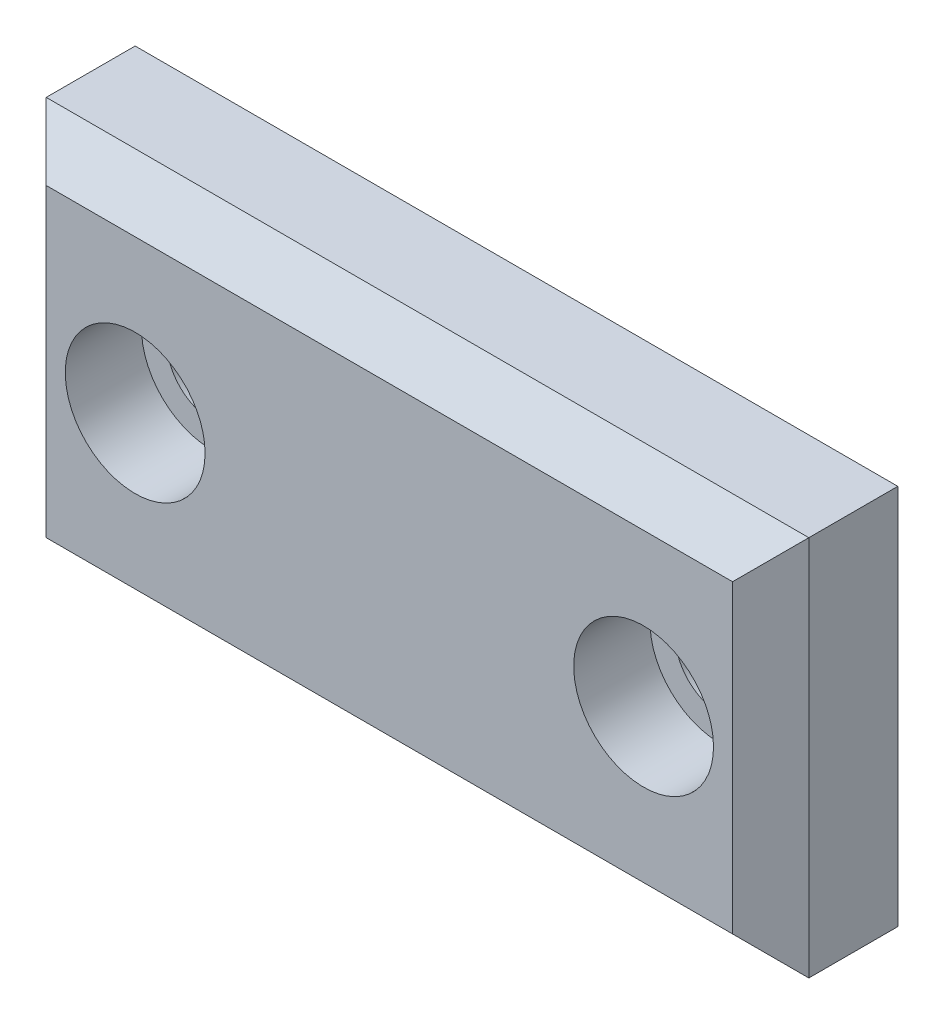
ISO-10303-21;
HEADER;
FILE_DESCRIPTION(('STEP AP214'),'2;1');
FILE_NAME('part.step','',(''),(''),'','','');
FILE_SCHEMA(('AUTOMOTIVE_DESIGN { 1 0 10303 214 1 1 1 1 }'));
ENDSEC;
DATA;
#1=APPLICATION_CONTEXT('core data for automotive mechanical design processes');
#2=APPLICATION_PROTOCOL_DEFINITION('international standard','automotive_design',2000,#1);
#3=PRODUCT_CONTEXT('',#1,'mechanical');
#4=PRODUCT('Part','Part','',(#3));
#5=PRODUCT_RELATED_PRODUCT_CATEGORY('part','',(#4));
#6=PRODUCT_DEFINITION_FORMATION('','',#4);
#7=PRODUCT_DEFINITION_CONTEXT('part definition',#1,'design');
#8=PRODUCT_DEFINITION('design','',#6,#7);
#9=PRODUCT_DEFINITION_SHAPE('','',#8);
#10=(LENGTH_UNIT() NAMED_UNIT(*) SI_UNIT(.MILLI.,.METRE.));
#11=(NAMED_UNIT(*) PLANE_ANGLE_UNIT() SI_UNIT($,.RADIAN.));
#12=(NAMED_UNIT(*) SI_UNIT($,.STERADIAN.) SOLID_ANGLE_UNIT());
#13=UNCERTAINTY_MEASURE_WITH_UNIT(LENGTH_MEASURE(1.E-05),#10,'distance_accuracy_value','');
#14=(GEOMETRIC_REPRESENTATION_CONTEXT(3) GLOBAL_UNCERTAINTY_ASSIGNED_CONTEXT((#13)) GLOBAL_UNIT_ASSIGNED_CONTEXT((#10,
#11,#12)) REPRESENTATION_CONTEXT('',''));
#15=CARTESIAN_POINT('',(0.,0.,0.));
#16=DIRECTION('',(0.,0.,1.));
#17=DIRECTION('',(1.,0.,0.));
#18=AXIS2_PLACEMENT_3D('',#15,#16,#17);
#19=CARTESIAN_POINT('',(20.,0.,0.));
#20=DIRECTION('',(0.,0.,1.));
#21=DIRECTION('',(1.,0.,0.));
#22=AXIS2_PLACEMENT_3D('',#19,#20,#21);
#23=CYLINDRICAL_SURFACE('',#22,3.5);
#24=CARTESIAN_POINT('',(20.,0.,0.));
#25=DIRECTION('',(0.,0.,1.));
#26=DIRECTION('',(1.,0.,0.));
#27=AXIS2_PLACEMENT_3D('',#24,#25,#26);
#28=CIRCLE('',#27,3.5);
#29=CARTESIAN_POINT('',(23.5,0.,0.));
#30=VERTEX_POINT('',#29);
#31=EDGE_CURVE('E147',#30,#30,#28,.T.);
#32=ORIENTED_EDGE('',*,*,#31,.F.);
#33=EDGE_LOOP('',(#32));
#34=FACE_BOUND('',#33,.T.);
#35=CARTESIAN_POINT('',(20.,0.,4.));
#36=DIRECTION('',(0.,0.,1.));
#37=DIRECTION('',(1.,0.,0.));
#38=AXIS2_PLACEMENT_3D('',#35,#36,#37);
#39=CIRCLE('',#38,3.5);
#40=CARTESIAN_POINT('',(23.5,0.,4.));
#41=VERTEX_POINT('',#40);
#42=EDGE_CURVE('E40',#41,#41,#39,.F.);
#43=ORIENTED_EDGE('',*,*,#42,.F.);
#44=EDGE_LOOP('',(#43));
#45=FACE_BOUND('',#44,.T.);
#46=ADVANCED_FACE('F36',(#34,#45),#23,.F.);
#47=CARTESIAN_POINT('',(-20.,0.,0.));
#48=DIRECTION('',(0.,0.,1.));
#49=DIRECTION('',(1.,0.,0.));
#50=AXIS2_PLACEMENT_3D('',#47,#48,#49);
#51=CYLINDRICAL_SURFACE('',#50,3.5);
#52=CARTESIAN_POINT('',(-20.,0.,0.));
#53=DIRECTION('',(0.,0.,1.));
#54=DIRECTION('',(1.,0.,0.));
#55=AXIS2_PLACEMENT_3D('',#52,#53,#54);
#56=CIRCLE('',#55,3.5);
#57=CARTESIAN_POINT('',(-16.5,0.,0.));
#58=VERTEX_POINT('',#57);
#59=EDGE_CURVE('E117',#58,#58,#56,.T.);
#60=ORIENTED_EDGE('',*,*,#59,.F.);
#61=EDGE_LOOP('',(#60));
#62=FACE_BOUND('',#61,.T.);
#63=CARTESIAN_POINT('',(-20.,0.,4.));
#64=DIRECTION('',(0.,0.,1.));
#65=DIRECTION('',(1.,0.,0.));
#66=AXIS2_PLACEMENT_3D('',#63,#64,#65);
#67=CIRCLE('',#66,3.5);
#68=CARTESIAN_POINT('',(-16.5,0.,4.));
#69=VERTEX_POINT('',#68);
#70=EDGE_CURVE('E145',#69,#69,#67,.F.);
#71=ORIENTED_EDGE('',*,*,#70,.F.);
#72=EDGE_LOOP('',(#71));
#73=FACE_BOUND('',#72,.T.);
#74=ADVANCED_FACE('F173',(#62,#73),#51,.F.);
#75=CARTESIAN_POINT('',(30.,-15.,10.));
#76=DIRECTION('',(-1.,0.,0.));
#77=DIRECTION('',(0.,0.,1.));
#78=AXIS2_PLACEMENT_3D('',#75,#76,#77);
#79=PLANE('',#78);
#80=DIRECTION('',(0.,0.,-1.));
#81=VECTOR('',#80,1.);
#82=CARTESIAN_POINT('',(30.,15.,10.));
#83=LINE('',#82,#81);
#84=CARTESIAN_POINT('',(30.,15.,6.99999999999998));
#85=VERTEX_POINT('',#84);
#86=CARTESIAN_POINT('',(30.,15.,0.));
#87=VERTEX_POINT('',#86);
#88=EDGE_CURVE('E88',#85,#87,#83,.T.);
#89=ORIENTED_EDGE('',*,*,#88,.F.);
#90=DIRECTION('',(0.,-1.,0.));
#91=VECTOR('',#90,1.);
#92=CARTESIAN_POINT('',(30.,-15.,6.99999999999998));
#93=LINE('',#92,#91);
#94=CARTESIAN_POINT('',(30.,-15.,6.99999999999998));
#95=VERTEX_POINT('',#94);
#96=EDGE_CURVE('E11',#85,#95,#93,.T.);
#97=ORIENTED_EDGE('',*,*,#96,.T.);
#98=DIRECTION('',(0.,0.,-1.));
#99=VECTOR('',#98,1.);
#100=CARTESIAN_POINT('',(30.,-15.,10.));
#101=LINE('',#100,#99);
#102=CARTESIAN_POINT('',(30.,-15.,0.));
#103=VERTEX_POINT('',#102);
#104=EDGE_CURVE('E109',#95,#103,#101,.T.);
#105=ORIENTED_EDGE('',*,*,#104,.T.);
#106=DIRECTION('',(0.,1.,0.));
#107=VECTOR('',#106,1.);
#108=CARTESIAN_POINT('',(30.,-15.,0.));
#109=LINE('',#108,#107);
#110=EDGE_CURVE('E103',#103,#87,#109,.T.);
#111=ORIENTED_EDGE('',*,*,#110,.T.);
#112=EDGE_LOOP('',(#89,#97,#105,#111));
#113=FACE_BOUND('',#112,.T.);
#114=ADVANCED_FACE('F107',(#113),#79,.F.);
#115=CARTESIAN_POINT('',(-30.,15.,10.));
#116=DIRECTION('',(0.,-1.,0.));
#117=DIRECTION('',(0.,0.,-1.));
#118=AXIS2_PLACEMENT_3D('',#115,#116,#117);
#119=PLANE('',#118);
#120=DIRECTION('',(0.,0.,-1.));
#121=VECTOR('',#120,1.);
#122=CARTESIAN_POINT('',(-30.,15.,10.));
#123=LINE('',#122,#121);
#124=CARTESIAN_POINT('',(-30.,15.,6.99999999999998));
#125=VERTEX_POINT('',#124);
#126=CARTESIAN_POINT('',(-30.,15.,0.));
#127=VERTEX_POINT('',#126);
#128=EDGE_CURVE('E97',#125,#127,#123,.T.);
#129=ORIENTED_EDGE('',*,*,#128,.F.);
#130=DIRECTION('',(1.,0.,0.));
#131=VECTOR('',#130,1.);
#132=CARTESIAN_POINT('',(-30.,15.,6.99999999999998));
#133=LINE('',#132,#131);
#134=EDGE_CURVE('E45',#125,#85,#133,.T.);
#135=ORIENTED_EDGE('',*,*,#134,.T.);
#136=ORIENTED_EDGE('',*,*,#88,.T.);
#137=DIRECTION('',(-1.,0.,0.));
#138=VECTOR('',#137,1.);
#139=CARTESIAN_POINT('',(-30.,15.,0.));
#140=LINE('',#139,#138);
#141=EDGE_CURVE('E91',#87,#127,#140,.T.);
#142=ORIENTED_EDGE('',*,*,#141,.T.);
#143=EDGE_LOOP('',(#129,#135,#136,#142));
#144=FACE_BOUND('',#143,.T.);
#145=ADVANCED_FACE('F90',(#144),#119,.F.);
#146=CARTESIAN_POINT('',(-30.,-15.,10.));
#147=DIRECTION('',(1.,0.,0.));
#148=DIRECTION('',(0.,0.,-1.));
#149=AXIS2_PLACEMENT_3D('',#146,#147,#148);
#150=PLANE('',#149);
#151=DIRECTION('',(0.,0.,-1.));
#152=VECTOR('',#151,1.);
#153=CARTESIAN_POINT('',(-30.,-15.,10.));
#154=LINE('',#153,#152);
#155=CARTESIAN_POINT('',(-30.,-15.,6.99999999999998));
#156=VERTEX_POINT('',#155);
#157=CARTESIAN_POINT('',(-30.,-15.,0.));
#158=VERTEX_POINT('',#157);
#159=EDGE_CURVE('E124',#156,#158,#154,.T.);
#160=ORIENTED_EDGE('',*,*,#159,.F.);
#161=DIRECTION('',(0.,1.,0.));
#162=VECTOR('',#161,1.);
#163=CARTESIAN_POINT('',(-30.,-15.,6.99999999999998));
#164=LINE('',#163,#162);
#165=EDGE_CURVE('E60',#156,#125,#164,.T.);
#166=ORIENTED_EDGE('',*,*,#165,.T.);
#167=ORIENTED_EDGE('',*,*,#128,.T.);
#168=DIRECTION('',(0.,-1.,0.));
#169=VECTOR('',#168,1.);
#170=CARTESIAN_POINT('',(-30.,-15.,0.));
#171=LINE('',#170,#169);
#172=EDGE_CURVE('E105',#127,#158,#171,.T.);
#173=ORIENTED_EDGE('',*,*,#172,.T.);
#174=EDGE_LOOP('',(#160,#166,#167,#173));
#175=FACE_BOUND('',#174,.T.);
#176=ADVANCED_FACE('F196',(#175),#150,.F.);
#177=CARTESIAN_POINT('',(-30.,-15.,10.));
#178=DIRECTION('',(0.,1.,0.));
#179=DIRECTION('',(0.,0.,1.));
#180=AXIS2_PLACEMENT_3D('',#177,#178,#179);
#181=PLANE('',#180);
#182=ORIENTED_EDGE('',*,*,#104,.F.);
#183=DIRECTION('',(-1.,0.,0.));
#184=VECTOR('',#183,1.);
#185=CARTESIAN_POINT('',(-30.,-15.,6.99999999999998));
#186=LINE('',#185,#184);
#187=EDGE_CURVE('E135',#95,#156,#186,.T.);
#188=ORIENTED_EDGE('',*,*,#187,.T.);
#189=ORIENTED_EDGE('',*,*,#159,.T.);
#190=DIRECTION('',(1.,0.,0.));
#191=VECTOR('',#190,1.);
#192=CARTESIAN_POINT('',(-30.,-15.,0.));
#193=LINE('',#192,#191);
#194=EDGE_CURVE('E121',#158,#103,#193,.T.);
#195=ORIENTED_EDGE('',*,*,#194,.T.);
#196=EDGE_LOOP('',(#182,#188,#189,#195));
#197=FACE_BOUND('',#196,.T.);
#198=ADVANCED_FACE('F189',(#197),#181,.F.);
#199=CARTESIAN_POINT('',(0.,0.,10.));
#200=DIRECTION('',(0.,0.,-1.));
#201=DIRECTION('',(-1.,0.,0.));
#202=AXIS2_PLACEMENT_3D('',#199,#200,#201);
#203=PLANE('',#202);
#204=CARTESIAN_POINT('',(20.,0.,10.));
#205=DIRECTION('',(0.,0.,1.));
#206=DIRECTION('',(1.,0.,0.));
#207=AXIS2_PLACEMENT_3D('',#204,#205,#206);
#208=CIRCLE('',#207,5.5);
#209=CARTESIAN_POINT('',(25.5,0.,10.));
#210=VERTEX_POINT('',#209);
#211=EDGE_CURVE('E160',#210,#210,#208,.T.);
#212=ORIENTED_EDGE('',*,*,#211,.F.);
#213=EDGE_LOOP('',(#212));
#214=FACE_BOUND('',#213,.T.);
#215=CARTESIAN_POINT('',(-20.,0.,10.));
#216=DIRECTION('',(0.,0.,1.));
#217=DIRECTION('',(1.,0.,0.));
#218=AXIS2_PLACEMENT_3D('',#215,#216,#217);
#219=CIRCLE('',#218,5.5);
#220=CARTESIAN_POINT('',(-14.5,0.,10.));
#221=VERTEX_POINT('',#220);
#222=EDGE_CURVE('E153',#221,#221,#219,.T.);
#223=ORIENTED_EDGE('',*,*,#222,.F.);
#224=EDGE_LOOP('',(#223));
#225=FACE_BOUND('',#224,.T.);
#226=DIRECTION('',(0.,-1.,0.));
#227=VECTOR('',#226,1.);
#228=CARTESIAN_POINT('',(-27.,0.,10.));
#229=LINE('',#228,#227);
#230=CARTESIAN_POINT('',(-27.,12.,10.));
#231=VERTEX_POINT('',#230);
#232=CARTESIAN_POINT('',(-27.,-12.,10.));
#233=VERTEX_POINT('',#232);
#234=EDGE_CURVE('E130',#231,#233,#229,.T.);
#235=ORIENTED_EDGE('',*,*,#234,.T.);
#236=DIRECTION('',(1.,0.,0.));
#237=VECTOR('',#236,1.);
#238=CARTESIAN_POINT('',(0.,-12.,10.));
#239=LINE('',#238,#237);
#240=CARTESIAN_POINT('',(27.,-12.,10.));
#241=VERTEX_POINT('',#240);
#242=EDGE_CURVE('E132',#233,#241,#239,.T.);
#243=ORIENTED_EDGE('',*,*,#242,.T.);
#244=DIRECTION('',(0.,1.,0.));
#245=VECTOR('',#244,1.);
#246=CARTESIAN_POINT('',(27.,0.,10.));
#247=LINE('',#246,#245);
#248=CARTESIAN_POINT('',(27.,12.,10.));
#249=VERTEX_POINT('',#248);
#250=EDGE_CURVE('E96',#241,#249,#247,.T.);
#251=ORIENTED_EDGE('',*,*,#250,.T.);
#252=DIRECTION('',(-1.,0.,0.));
#253=VECTOR('',#252,1.);
#254=CARTESIAN_POINT('',(0.,12.,10.));
#255=LINE('',#254,#253);
#256=EDGE_CURVE('E128',#249,#231,#255,.T.);
#257=ORIENTED_EDGE('',*,*,#256,.T.);
#258=EDGE_LOOP('',(#235,#243,#251,#257));
#259=FACE_BOUND('',#258,.T.);
#260=ADVANCED_FACE('F186',(#214,#225,#259),#203,.F.);
#261=CARTESIAN_POINT('',(0.,0.,0.));
#262=DIRECTION('',(0.,0.,-1.));
#263=DIRECTION('',(-1.,0.,0.));
#264=AXIS2_PLACEMENT_3D('',#261,#262,#263);
#265=PLANE('',#264);
#266=ORIENTED_EDGE('',*,*,#31,.T.);
#267=EDGE_LOOP('',(#266));
#268=FACE_BOUND('',#267,.T.);
#269=ORIENTED_EDGE('',*,*,#59,.T.);
#270=EDGE_LOOP('',(#269));
#271=FACE_BOUND('',#270,.T.);
#272=ORIENTED_EDGE('',*,*,#110,.F.);
#273=ORIENTED_EDGE('',*,*,#194,.F.);
#274=ORIENTED_EDGE('',*,*,#172,.F.);
#275=ORIENTED_EDGE('',*,*,#141,.F.);
#276=EDGE_LOOP('',(#272,#273,#274,#275));
#277=FACE_BOUND('',#276,.T.);
#278=ADVANCED_FACE('F101',(#268,#271,#277),#265,.T.);
#279=CARTESIAN_POINT('',(0.,12.,10.));
#280=DIRECTION('',(0.,-0.707106781186549,-0.707106781186546));
#281=DIRECTION('',(-1.,0.,0.));
#282=AXIS2_PLACEMENT_3D('',#279,#280,#281);
#283=PLANE('',#282);
#284=DIRECTION('',(-0.577350269189625,-0.577350269189625,0.577350269189628));
#285=VECTOR('',#284,1.);
#286=CARTESIAN_POINT('',(23.,8.00000000000001,14.));
#287=LINE('',#286,#285);
#288=EDGE_CURVE('E114',#85,#249,#287,.T.);
#289=ORIENTED_EDGE('',*,*,#288,.F.);
#290=ORIENTED_EDGE('',*,*,#134,.F.);
#291=DIRECTION('',(0.577350269189625,-0.577350269189625,0.577350269189628));
#292=VECTOR('',#291,1.);
#293=CARTESIAN_POINT('',(-18.,3.00000000000003,19.));
#294=LINE('',#293,#292);
#295=EDGE_CURVE('E111',#231,#125,#294,.F.);
#296=ORIENTED_EDGE('',*,*,#295,.F.);
#297=ORIENTED_EDGE('',*,*,#256,.F.);
#298=EDGE_LOOP('',(#289,#290,#296,#297));
#299=FACE_BOUND('',#298,.T.);
#300=ADVANCED_FACE('F38',(#299),#283,.F.);
#301=CARTESIAN_POINT('',(-27.,0.,10.));
#302=DIRECTION('',(0.707106781186549,0.,-0.707106781186546));
#303=DIRECTION('',(0.,-1.,0.));
#304=AXIS2_PLACEMENT_3D('',#301,#302,#303);
#305=PLANE('',#304);
#306=ORIENTED_EDGE('',*,*,#295,.T.);
#307=ORIENTED_EDGE('',*,*,#165,.F.);
#308=DIRECTION('',(0.577350269189625,0.577350269189625,0.577350269189628));
#309=VECTOR('',#308,1.);
#310=CARTESIAN_POINT('',(-23.,-8.00000000000001,14.));
#311=LINE('',#310,#309);
#312=EDGE_CURVE('E142',#233,#156,#311,.F.);
#313=ORIENTED_EDGE('',*,*,#312,.F.);
#314=ORIENTED_EDGE('',*,*,#234,.F.);
#315=EDGE_LOOP('',(#306,#307,#313,#314));
#316=FACE_BOUND('',#315,.T.);
#317=ADVANCED_FACE('F211',(#316),#305,.F.);
#318=CARTESIAN_POINT('',(27.,0.,10.));
#319=DIRECTION('',(-0.707106781186549,0.,-0.707106781186546));
#320=DIRECTION('',(0.,1.,0.));
#321=AXIS2_PLACEMENT_3D('',#318,#319,#320);
#322=PLANE('',#321);
#323=ORIENTED_EDGE('',*,*,#288,.T.);
#324=ORIENTED_EDGE('',*,*,#250,.F.);
#325=DIRECTION('',(0.577350269189625,-0.577350269189625,-0.577350269189628));
#326=VECTOR('',#325,1.);
#327=CARTESIAN_POINT('',(23.,-8.00000000000001,14.));
#328=LINE('',#327,#326);
#329=EDGE_CURVE('E140',#95,#241,#328,.F.);
#330=ORIENTED_EDGE('',*,*,#329,.F.);
#331=ORIENTED_EDGE('',*,*,#96,.F.);
#332=EDGE_LOOP('',(#323,#324,#330,#331));
#333=FACE_BOUND('',#332,.T.);
#334=ADVANCED_FACE('F208',(#333),#322,.F.);
#335=CARTESIAN_POINT('',(0.,-12.,10.));
#336=DIRECTION('',(0.,0.707106781186549,-0.707106781186546));
#337=DIRECTION('',(1.,0.,0.));
#338=AXIS2_PLACEMENT_3D('',#335,#336,#337);
#339=PLANE('',#338);
#340=ORIENTED_EDGE('',*,*,#312,.T.);
#341=ORIENTED_EDGE('',*,*,#187,.F.);
#342=ORIENTED_EDGE('',*,*,#329,.T.);
#343=ORIENTED_EDGE('',*,*,#242,.F.);
#344=EDGE_LOOP('',(#340,#341,#342,#343));
#345=FACE_BOUND('',#344,.T.);
#346=ADVANCED_FACE('F204',(#345),#339,.F.);
#347=CARTESIAN_POINT('',(-20.,0.,4.));
#348=DIRECTION('',(0.,0.,1.));
#349=DIRECTION('',(1.,0.,0.));
#350=AXIS2_PLACEMENT_3D('',#347,#348,#349);
#351=PLANE('',#350);
#352=CARTESIAN_POINT('',(-20.,0.,4.));
#353=DIRECTION('',(0.,0.,1.));
#354=DIRECTION('',(1.,0.,0.));
#355=AXIS2_PLACEMENT_3D('',#352,#353,#354);
#356=CIRCLE('',#355,5.5);
#357=CARTESIAN_POINT('',(-14.5,0.,4.));
#358=VERTEX_POINT('',#357);
#359=EDGE_CURVE('E148',#358,#358,#356,.T.);
#360=ORIENTED_EDGE('',*,*,#359,.T.);
#361=EDGE_LOOP('',(#360));
#362=FACE_BOUND('',#361,.T.);
#363=ORIENTED_EDGE('',*,*,#70,.T.);
#364=EDGE_LOOP('',(#363));
#365=FACE_BOUND('',#364,.T.);
#366=ADVANCED_FACE('F207',(#362,#365),#351,.T.);
#367=CARTESIAN_POINT('',(-20.,0.,4.));
#368=DIRECTION('',(0.,0.,1.));
#369=DIRECTION('',(1.,0.,0.));
#370=AXIS2_PLACEMENT_3D('',#367,#368,#369);
#371=CYLINDRICAL_SURFACE('',#370,5.5);
#372=ORIENTED_EDGE('',*,*,#359,.F.);
#373=EDGE_LOOP('',(#372));
#374=FACE_BOUND('',#373,.T.);
#375=ORIENTED_EDGE('',*,*,#222,.T.);
#376=EDGE_LOOP('',(#375));
#377=FACE_BOUND('',#376,.T.);
#378=ADVANCED_FACE('F183',(#374,#377),#371,.F.);
#379=CARTESIAN_POINT('',(20.,0.,4.));
#380=DIRECTION('',(0.,0.,1.));
#381=DIRECTION('',(1.,0.,0.));
#382=AXIS2_PLACEMENT_3D('',#379,#380,#381);
#383=PLANE('',#382);
#384=CARTESIAN_POINT('',(20.,0.,4.));
#385=DIRECTION('',(0.,0.,1.));
#386=DIRECTION('',(1.,0.,0.));
#387=AXIS2_PLACEMENT_3D('',#384,#385,#386);
#388=CIRCLE('',#387,5.5);
#389=CARTESIAN_POINT('',(25.5,0.,4.));
#390=VERTEX_POINT('',#389);
#391=EDGE_CURVE('E163',#390,#390,#388,.T.);
#392=ORIENTED_EDGE('',*,*,#391,.T.);
#393=EDGE_LOOP('',(#392));
#394=FACE_BOUND('',#393,.T.);
#395=ORIENTED_EDGE('',*,*,#42,.T.);
#396=EDGE_LOOP('',(#395));
#397=FACE_BOUND('',#396,.T.);
#398=ADVANCED_FACE('F170',(#394,#397),#383,.T.);
#399=CARTESIAN_POINT('',(20.,0.,4.));
#400=DIRECTION('',(0.,0.,1.));
#401=DIRECTION('',(1.,0.,0.));
#402=AXIS2_PLACEMENT_3D('',#399,#400,#401);
#403=CYLINDRICAL_SURFACE('',#402,5.5);
#404=ORIENTED_EDGE('',*,*,#391,.F.);
#405=EDGE_LOOP('',(#404));
#406=FACE_BOUND('',#405,.T.);
#407=ORIENTED_EDGE('',*,*,#211,.T.);
#408=EDGE_LOOP('',(#407));
#409=FACE_BOUND('',#408,.T.);
#410=ADVANCED_FACE('F340',(#406,#409),#403,.F.);
#411=CLOSED_SHELL('',(#46,#74,#114,#145,#176,#198,#260,#278,#300,#317,#334,#346,#366,#378,#398,#410));
#412=MANIFOLD_SOLID_BREP('B2',#411);
#413=ADVANCED_BREP_SHAPE_REPRESENTATION('',(#18,#412),#14);
#414=SHAPE_DEFINITION_REPRESENTATION(#9,#413);
ENDSEC;
END-ISO-10303-21;
